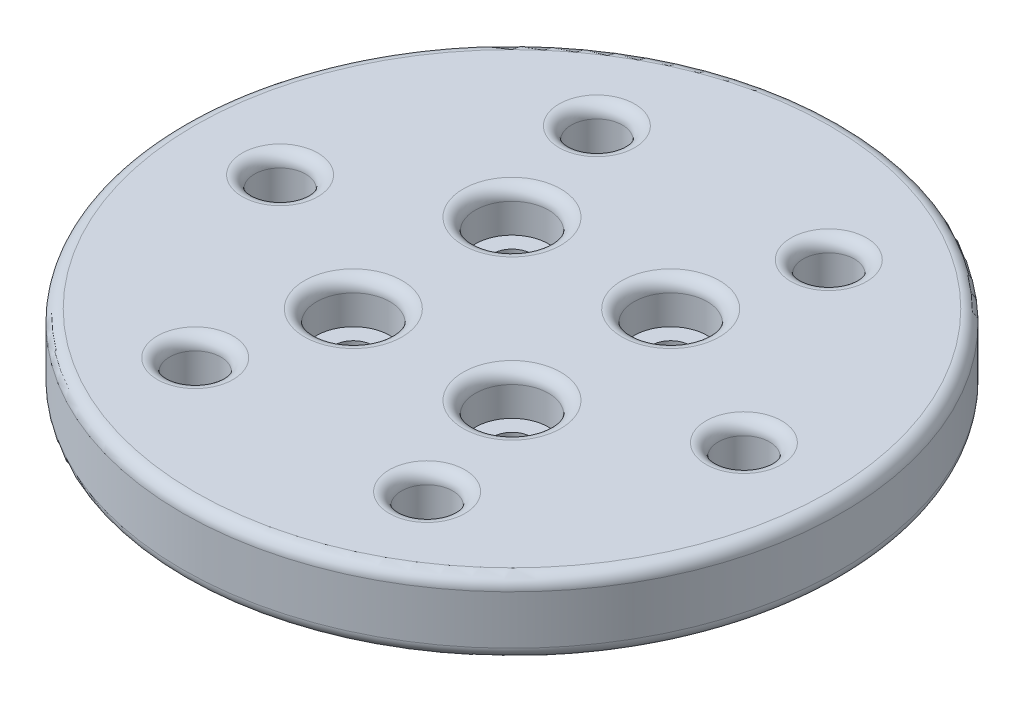
ISO-10303-21;
HEADER;
FILE_DESCRIPTION(('STEP AP214'),'2;1');
FILE_NAME('part.step','',(''),(''),'','','');
FILE_SCHEMA(('AUTOMOTIVE_DESIGN { 1 0 10303 214 1 1 1 1 }'));
ENDSEC;
DATA;
#1=APPLICATION_CONTEXT('core data for automotive mechanical design processes');
#2=APPLICATION_PROTOCOL_DEFINITION('international standard','automotive_design',2000,#1);
#3=PRODUCT_CONTEXT('',#1,'mechanical');
#4=PRODUCT('Part','Part','',(#3));
#5=PRODUCT_RELATED_PRODUCT_CATEGORY('part','',(#4));
#6=PRODUCT_DEFINITION_FORMATION('','',#4);
#7=PRODUCT_DEFINITION_CONTEXT('part definition',#1,'design');
#8=PRODUCT_DEFINITION('design','',#6,#7);
#9=PRODUCT_DEFINITION_SHAPE('','',#8);
#10=(LENGTH_UNIT() NAMED_UNIT(*) SI_UNIT(.MILLI.,.METRE.));
#11=(NAMED_UNIT(*) PLANE_ANGLE_UNIT() SI_UNIT($,.RADIAN.));
#12=(NAMED_UNIT(*) SI_UNIT($,.STERADIAN.) SOLID_ANGLE_UNIT());
#13=UNCERTAINTY_MEASURE_WITH_UNIT(LENGTH_MEASURE(1.E-05),#10,'distance_accuracy_value','');
#14=(GEOMETRIC_REPRESENTATION_CONTEXT(3) GLOBAL_UNCERTAINTY_ASSIGNED_CONTEXT((#13)) GLOBAL_UNIT_ASSIGNED_CONTEXT((#10,
#11,#12)) REPRESENTATION_CONTEXT('',''));
#15=CARTESIAN_POINT('',(0.,0.,0.));
#16=DIRECTION('',(0.,0.,1.));
#17=DIRECTION('',(1.,0.,0.));
#18=AXIS2_PLACEMENT_3D('',#15,#16,#17);
#19=CARTESIAN_POINT('',(6.5,0.,-6.5));
#20=DIRECTION('',(0.,1.,0.));
#21=DIRECTION('',(0.,0.,1.));
#22=AXIS2_PLACEMENT_3D('',#19,#20,#21);
#23=CYLINDRICAL_SURFACE('',#22,1.6);
#24=CARTESIAN_POINT('',(6.5,1.,-6.5));
#25=DIRECTION('',(0.,1.,0.));
#26=DIRECTION('',(0.,0.,1.));
#27=AXIS2_PLACEMENT_3D('',#24,#25,#26);
#28=CIRCLE('',#27,1.6);
#29=CARTESIAN_POINT('',(6.5,1.,-4.9));
#30=VERTEX_POINT('',#29);
#31=EDGE_CURVE('E117',#30,#30,#28,.F.);
#32=ORIENTED_EDGE('',*,*,#31,.T.);
#33=EDGE_LOOP('',(#32));
#34=FACE_BOUND('',#33,.T.);
#35=CARTESIAN_POINT('',(6.5,2.6,-6.5));
#36=DIRECTION('',(0.,1.,0.));
#37=DIRECTION('',(0.,0.,1.));
#38=AXIS2_PLACEMENT_3D('',#35,#36,#37);
#39=CIRCLE('',#38,1.6);
#40=CARTESIAN_POINT('',(6.5,2.6,-4.9));
#41=VERTEX_POINT('',#40);
#42=EDGE_CURVE('E221',#41,#41,#39,.F.);
#43=ORIENTED_EDGE('',*,*,#42,.F.);
#44=EDGE_LOOP('',(#43));
#45=FACE_BOUND('',#44,.T.);
#46=ADVANCED_FACE('F37',(#34,#45),#23,.F.);
#47=CARTESIAN_POINT('',(6.50000000000036,0.,6.5));
#48=DIRECTION('',(0.,1.,0.));
#49=DIRECTION('',(0.,0.,1.));
#50=AXIS2_PLACEMENT_3D('',#47,#48,#49);
#51=CYLINDRICAL_SURFACE('',#50,1.6);
#52=CARTESIAN_POINT('',(6.50000000000036,1.,6.5));
#53=DIRECTION('',(0.,1.,0.));
#54=DIRECTION('',(0.,0.,1.));
#55=AXIS2_PLACEMENT_3D('',#52,#53,#54);
#56=CIRCLE('',#55,1.6);
#57=CARTESIAN_POINT('',(6.50000000000036,1.,8.1));
#58=VERTEX_POINT('',#57);
#59=EDGE_CURVE('E113',#58,#58,#56,.F.);
#60=ORIENTED_EDGE('',*,*,#59,.T.);
#61=EDGE_LOOP('',(#60));
#62=FACE_BOUND('',#61,.T.);
#63=CARTESIAN_POINT('',(6.50000000000036,2.6,6.5));
#64=DIRECTION('',(0.,1.,0.));
#65=DIRECTION('',(0.,0.,1.));
#66=AXIS2_PLACEMENT_3D('',#63,#64,#65);
#67=CIRCLE('',#66,1.6);
#68=CARTESIAN_POINT('',(6.50000000000036,2.6,8.1));
#69=VERTEX_POINT('',#68);
#70=EDGE_CURVE('E225',#69,#69,#67,.F.);
#71=ORIENTED_EDGE('',*,*,#70,.F.);
#72=EDGE_LOOP('',(#71));
#73=FACE_BOUND('',#72,.T.);
#74=ADVANCED_FACE('F273',(#62,#73),#51,.F.);
#75=CARTESIAN_POINT('',(-6.49999999999964,0.,6.50000000000036));
#76=DIRECTION('',(0.,1.,0.));
#77=DIRECTION('',(0.,0.,1.));
#78=AXIS2_PLACEMENT_3D('',#75,#76,#77);
#79=CYLINDRICAL_SURFACE('',#78,1.6);
#80=CARTESIAN_POINT('',(-6.49999999999964,1.,6.50000000000036));
#81=DIRECTION('',(0.,1.,0.));
#82=DIRECTION('',(0.,0.,1.));
#83=AXIS2_PLACEMENT_3D('',#80,#81,#82);
#84=CIRCLE('',#83,1.6);
#85=CARTESIAN_POINT('',(-6.49999999999964,1.,8.10000000000036));
#86=VERTEX_POINT('',#85);
#87=EDGE_CURVE('E109',#86,#86,#84,.F.);
#88=ORIENTED_EDGE('',*,*,#87,.T.);
#89=EDGE_LOOP('',(#88));
#90=FACE_BOUND('',#89,.T.);
#91=CARTESIAN_POINT('',(-6.49999999999964,2.6,6.50000000000036));
#92=DIRECTION('',(0.,1.,0.));
#93=DIRECTION('',(0.,0.,1.));
#94=AXIS2_PLACEMENT_3D('',#91,#92,#93);
#95=CIRCLE('',#94,1.6);
#96=CARTESIAN_POINT('',(-6.49999999999964,2.6,8.10000000000036));
#97=VERTEX_POINT('',#96);
#98=EDGE_CURVE('E229',#97,#97,#95,.F.);
#99=ORIENTED_EDGE('',*,*,#98,.F.);
#100=EDGE_LOOP('',(#99));
#101=FACE_BOUND('',#100,.T.);
#102=ADVANCED_FACE('F279',(#90,#101),#79,.F.);
#103=CARTESIAN_POINT('',(-6.5,0.,-6.49999999999964));
#104=DIRECTION('',(0.,1.,0.));
#105=DIRECTION('',(0.,0.,1.));
#106=AXIS2_PLACEMENT_3D('',#103,#104,#105);
#107=CYLINDRICAL_SURFACE('',#106,1.6);
#108=CARTESIAN_POINT('',(-6.5,1.,-6.49999999999964));
#109=DIRECTION('',(0.,1.,0.));
#110=DIRECTION('',(0.,0.,1.));
#111=AXIS2_PLACEMENT_3D('',#108,#109,#110);
#112=CIRCLE('',#111,1.6);
#113=CARTESIAN_POINT('',(-6.5,1.,-4.89999999999964));
#114=VERTEX_POINT('',#113);
#115=EDGE_CURVE('E105',#114,#114,#112,.F.);
#116=ORIENTED_EDGE('',*,*,#115,.T.);
#117=EDGE_LOOP('',(#116));
#118=FACE_BOUND('',#117,.T.);
#119=CARTESIAN_POINT('',(-6.5,2.6,-6.49999999999964));
#120=DIRECTION('',(0.,1.,0.));
#121=DIRECTION('',(0.,0.,1.));
#122=AXIS2_PLACEMENT_3D('',#119,#120,#121);
#123=CIRCLE('',#122,1.6);
#124=CARTESIAN_POINT('',(-6.5,2.6,-4.89999999999964));
#125=VERTEX_POINT('',#124);
#126=EDGE_CURVE('E233',#125,#125,#123,.F.);
#127=ORIENTED_EDGE('',*,*,#126,.F.);
#128=EDGE_LOOP('',(#127));
#129=FACE_BOUND('',#128,.T.);
#130=ADVANCED_FACE('F285',(#118,#129),#107,.F.);
#131=CARTESIAN_POINT('',(0.,6.,0.));
#132=DIRECTION('',(0.,1.,0.));
#133=DIRECTION('',(0.,0.,1.));
#134=AXIS2_PLACEMENT_3D('',#131,#132,#133);
#135=PLANE('',#134);
#136=CARTESIAN_POINT('',(9.50000000000019,6.,-16.4544826719042));
#137=DIRECTION('',(0.,1.,0.));
#138=DIRECTION('',(0.,0.,1.));
#139=AXIS2_PLACEMENT_3D('',#136,#137,#138);
#140=CIRCLE('',#139,3.1);
#141=CARTESIAN_POINT('',(9.50000000000019,6.,-13.3544826719042));
#142=VERTEX_POINT('',#141);
#143=EDGE_CURVE('E61',#142,#142,#140,.F.);
#144=ORIENTED_EDGE('',*,*,#143,.T.);
#145=EDGE_LOOP('',(#144));
#146=FACE_BOUND('',#145,.T.);
#147=CARTESIAN_POINT('',(-19.,6.,-1.32676290876039E-13));
#148=DIRECTION('',(0.,1.,0.));
#149=DIRECTION('',(0.,0.,1.));
#150=AXIS2_PLACEMENT_3D('',#147,#148,#149);
#151=CIRCLE('',#150,3.1);
#152=CARTESIAN_POINT('',(-19.,6.,3.09999999999987));
#153=VERTEX_POINT('',#152);
#154=EDGE_CURVE('E65',#153,#153,#151,.F.);
#155=ORIENTED_EDGE('',*,*,#154,.T.);
#156=EDGE_LOOP('',(#155));
#157=FACE_BOUND('',#156,.T.);
#158=CARTESIAN_POINT('',(9.49999999999996,6.,16.4544826719044));
#159=DIRECTION('',(0.,1.,0.));
#160=DIRECTION('',(0.,0.,1.));
#161=AXIS2_PLACEMENT_3D('',#158,#159,#160);
#162=CIRCLE('',#161,3.1);
#163=CARTESIAN_POINT('',(9.49999999999996,6.,19.5544826719043));
#164=VERTEX_POINT('',#163);
#165=EDGE_CURVE('E69',#164,#164,#162,.F.);
#166=ORIENTED_EDGE('',*,*,#165,.T.);
#167=EDGE_LOOP('',(#166));
#168=FACE_BOUND('',#167,.T.);
#169=CARTESIAN_POINT('',(0.,6.,0.));
#170=DIRECTION('',(0.,1.,0.));
#171=DIRECTION('',(0.,0.,1.));
#172=AXIS2_PLACEMENT_3D('',#169,#170,#171);
#173=CIRCLE('',#172,26.);
#174=CARTESIAN_POINT('',(0.,6.,26.));
#175=VERTEX_POINT('',#174);
#176=EDGE_CURVE('E73',#175,#175,#173,.T.);
#177=ORIENTED_EDGE('',*,*,#176,.T.);
#178=EDGE_LOOP('',(#177));
#179=FACE_BOUND('',#178,.T.);
#180=CARTESIAN_POINT('',(19.,6.,0.));
#181=DIRECTION('',(0.,1.,0.));
#182=DIRECTION('',(0.,0.,1.));
#183=AXIS2_PLACEMENT_3D('',#180,#181,#182);
#184=CIRCLE('',#183,3.1);
#185=CARTESIAN_POINT('',(19.,6.,3.1));
#186=VERTEX_POINT('',#185);
#187=EDGE_CURVE('E77',#186,#186,#184,.F.);
#188=ORIENTED_EDGE('',*,*,#187,.T.);
#189=EDGE_LOOP('',(#188));
#190=FACE_BOUND('',#189,.T.);
#191=CARTESIAN_POINT('',(-9.50000000000008,6.,16.4544826719043));
#192=DIRECTION('',(0.,1.,0.));
#193=DIRECTION('',(0.,0.,1.));
#194=AXIS2_PLACEMENT_3D('',#191,#192,#193);
#195=CIRCLE('',#194,3.1);
#196=CARTESIAN_POINT('',(-9.50000000000008,6.,19.5544826719043));
#197=VERTEX_POINT('',#196);
#198=EDGE_CURVE('E81',#197,#197,#195,.F.);
#199=ORIENTED_EDGE('',*,*,#198,.T.);
#200=EDGE_LOOP('',(#199));
#201=FACE_BOUND('',#200,.T.);
#202=CARTESIAN_POINT('',(-9.49999999999985,6.,-16.4544826719044));
#203=DIRECTION('',(0.,1.,0.));
#204=DIRECTION('',(0.,0.,1.));
#205=AXIS2_PLACEMENT_3D('',#202,#203,#204);
#206=CIRCLE('',#205,3.1);
#207=CARTESIAN_POINT('',(-9.49999999999985,6.,-13.3544826719044));
#208=VERTEX_POINT('',#207);
#209=EDGE_CURVE('E85',#208,#208,#206,.F.);
#210=ORIENTED_EDGE('',*,*,#209,.T.);
#211=EDGE_LOOP('',(#210));
#212=FACE_BOUND('',#211,.T.);
#213=CARTESIAN_POINT('',(6.5,6.,-6.5));
#214=DIRECTION('',(0.,1.,0.));
#215=DIRECTION('',(0.,0.,1.));
#216=AXIS2_PLACEMENT_3D('',#213,#214,#215);
#217=CIRCLE('',#216,4.);
#218=CARTESIAN_POINT('',(6.5,6.,-2.5));
#219=VERTEX_POINT('',#218);
#220=EDGE_CURVE('E89',#219,#219,#217,.F.);
#221=ORIENTED_EDGE('',*,*,#220,.T.);
#222=EDGE_LOOP('',(#221));
#223=FACE_BOUND('',#222,.T.);
#224=CARTESIAN_POINT('',(6.50000000000036,6.,6.5));
#225=DIRECTION('',(0.,1.,0.));
#226=DIRECTION('',(0.,0.,1.));
#227=AXIS2_PLACEMENT_3D('',#224,#225,#226);
#228=CIRCLE('',#227,4.);
#229=CARTESIAN_POINT('',(6.50000000000036,6.,10.5));
#230=VERTEX_POINT('',#229);
#231=EDGE_CURVE('E93',#230,#230,#228,.F.);
#232=ORIENTED_EDGE('',*,*,#231,.T.);
#233=EDGE_LOOP('',(#232));
#234=FACE_BOUND('',#233,.T.);
#235=CARTESIAN_POINT('',(-6.49999999999964,6.,6.50000000000036));
#236=DIRECTION('',(0.,1.,0.));
#237=DIRECTION('',(0.,0.,1.));
#238=AXIS2_PLACEMENT_3D('',#235,#236,#237);
#239=CIRCLE('',#238,4.);
#240=CARTESIAN_POINT('',(-6.49999999999964,6.,10.5000000000004));
#241=VERTEX_POINT('',#240);
#242=EDGE_CURVE('E97',#241,#241,#239,.F.);
#243=ORIENTED_EDGE('',*,*,#242,.T.);
#244=EDGE_LOOP('',(#243));
#245=FACE_BOUND('',#244,.T.);
#246=CARTESIAN_POINT('',(-6.5,6.,-6.49999999999964));
#247=DIRECTION('',(0.,1.,0.));
#248=DIRECTION('',(0.,0.,1.));
#249=AXIS2_PLACEMENT_3D('',#246,#247,#248);
#250=CIRCLE('',#249,4.);
#251=CARTESIAN_POINT('',(-6.5,6.,-2.49999999999964));
#252=VERTEX_POINT('',#251);
#253=EDGE_CURVE('E101',#252,#252,#250,.F.);
#254=ORIENTED_EDGE('',*,*,#253,.T.);
#255=EDGE_LOOP('',(#254));
#256=FACE_BOUND('',#255,.T.);
#257=ADVANCED_FACE('F313',(#146,#157,#168,#179,#190,#201,#212,#223,#234,#245,#256),#135,.T.);
#258=CARTESIAN_POINT('',(0.,0.,0.));
#259=DIRECTION('',(0.,1.,0.));
#260=DIRECTION('',(0.,0.,1.));
#261=AXIS2_PLACEMENT_3D('',#258,#259,#260);
#262=PLANE('',#261);
#263=CARTESIAN_POINT('',(9.50000000000019,0.,-16.4544826719042));
#264=DIRECTION('',(0.,1.,0.));
#265=DIRECTION('',(0.,0.,1.));
#266=AXIS2_PLACEMENT_3D('',#263,#264,#265);
#267=CIRCLE('',#266,3.1);
#268=CARTESIAN_POINT('',(9.50000000000019,0.,-13.3544826719042));
#269=VERTEX_POINT('',#268);
#270=EDGE_CURVE('E177',#269,#269,#267,.T.);
#271=ORIENTED_EDGE('',*,*,#270,.T.);
#272=EDGE_LOOP('',(#271));
#273=FACE_BOUND('',#272,.T.);
#274=CARTESIAN_POINT('',(-9.49999999999985,0.,-16.4544826719044));
#275=DIRECTION('',(0.,1.,0.));
#276=DIRECTION('',(0.,0.,1.));
#277=AXIS2_PLACEMENT_3D('',#274,#275,#276);
#278=CIRCLE('',#277,3.1);
#279=CARTESIAN_POINT('',(-9.49999999999985,0.,-13.3544826719044));
#280=VERTEX_POINT('',#279);
#281=EDGE_CURVE('E181',#280,#280,#278,.T.);
#282=ORIENTED_EDGE('',*,*,#281,.T.);
#283=EDGE_LOOP('',(#282));
#284=FACE_BOUND('',#283,.T.);
#285=CARTESIAN_POINT('',(-19.,0.,-1.32676290876039E-13));
#286=DIRECTION('',(0.,1.,0.));
#287=DIRECTION('',(0.,0.,1.));
#288=AXIS2_PLACEMENT_3D('',#285,#286,#287);
#289=CIRCLE('',#288,3.1);
#290=CARTESIAN_POINT('',(-19.,0.,3.09999999999987));
#291=VERTEX_POINT('',#290);
#292=EDGE_CURVE('E185',#291,#291,#289,.T.);
#293=ORIENTED_EDGE('',*,*,#292,.T.);
#294=EDGE_LOOP('',(#293));
#295=FACE_BOUND('',#294,.T.);
#296=CARTESIAN_POINT('',(-9.50000000000008,0.,16.4544826719043));
#297=DIRECTION('',(0.,1.,0.));
#298=DIRECTION('',(0.,0.,1.));
#299=AXIS2_PLACEMENT_3D('',#296,#297,#298);
#300=CIRCLE('',#299,3.1);
#301=CARTESIAN_POINT('',(-9.50000000000008,0.,19.5544826719043));
#302=VERTEX_POINT('',#301);
#303=EDGE_CURVE('E189',#302,#302,#300,.T.);
#304=ORIENTED_EDGE('',*,*,#303,.T.);
#305=EDGE_LOOP('',(#304));
#306=FACE_BOUND('',#305,.T.);
#307=CARTESIAN_POINT('',(9.49999999999996,0.,16.4544826719044));
#308=DIRECTION('',(0.,1.,0.));
#309=DIRECTION('',(0.,0.,1.));
#310=AXIS2_PLACEMENT_3D('',#307,#308,#309);
#311=CIRCLE('',#310,3.1);
#312=CARTESIAN_POINT('',(9.49999999999996,0.,19.5544826719043));
#313=VERTEX_POINT('',#312);
#314=EDGE_CURVE('E193',#313,#313,#311,.T.);
#315=ORIENTED_EDGE('',*,*,#314,.T.);
#316=EDGE_LOOP('',(#315));
#317=FACE_BOUND('',#316,.T.);
#318=CARTESIAN_POINT('',(19.,0.,0.));
#319=DIRECTION('',(0.,1.,0.));
#320=DIRECTION('',(0.,0.,1.));
#321=AXIS2_PLACEMENT_3D('',#318,#319,#320);
#322=CIRCLE('',#321,3.1);
#323=CARTESIAN_POINT('',(19.,0.,3.1));
#324=VERTEX_POINT('',#323);
#325=EDGE_CURVE('E197',#324,#324,#322,.T.);
#326=ORIENTED_EDGE('',*,*,#325,.T.);
#327=EDGE_LOOP('',(#326));
#328=FACE_BOUND('',#327,.T.);
#329=CARTESIAN_POINT('',(0.,0.,0.));
#330=DIRECTION('',(0.,1.,0.));
#331=DIRECTION('',(0.,0.,1.));
#332=AXIS2_PLACEMENT_3D('',#329,#330,#331);
#333=CIRCLE('',#332,26.);
#334=CARTESIAN_POINT('',(0.,0.,26.));
#335=VERTEX_POINT('',#334);
#336=EDGE_CURVE('E201',#335,#335,#333,.F.);
#337=ORIENTED_EDGE('',*,*,#336,.T.);
#338=EDGE_LOOP('',(#337));
#339=FACE_BOUND('',#338,.T.);
#340=CARTESIAN_POINT('',(6.5,0.,-6.5));
#341=DIRECTION('',(0.,1.,0.));
#342=DIRECTION('',(0.,0.,1.));
#343=AXIS2_PLACEMENT_3D('',#340,#341,#342);
#344=CIRCLE('',#343,2.6);
#345=CARTESIAN_POINT('',(6.5,0.,-3.9));
#346=VERTEX_POINT('',#345);
#347=EDGE_CURVE('E205',#346,#346,#344,.T.);
#348=ORIENTED_EDGE('',*,*,#347,.T.);
#349=EDGE_LOOP('',(#348));
#350=FACE_BOUND('',#349,.T.);
#351=CARTESIAN_POINT('',(6.50000000000036,0.,6.5));
#352=DIRECTION('',(0.,1.,0.));
#353=DIRECTION('',(0.,0.,1.));
#354=AXIS2_PLACEMENT_3D('',#351,#352,#353);
#355=CIRCLE('',#354,2.6);
#356=CARTESIAN_POINT('',(6.50000000000036,0.,9.1));
#357=VERTEX_POINT('',#356);
#358=EDGE_CURVE('E209',#357,#357,#355,.T.);
#359=ORIENTED_EDGE('',*,*,#358,.T.);
#360=EDGE_LOOP('',(#359));
#361=FACE_BOUND('',#360,.T.);
#362=CARTESIAN_POINT('',(-6.49999999999964,0.,6.50000000000036));
#363=DIRECTION('',(0.,1.,0.));
#364=DIRECTION('',(0.,0.,1.));
#365=AXIS2_PLACEMENT_3D('',#362,#363,#364);
#366=CIRCLE('',#365,2.6);
#367=CARTESIAN_POINT('',(-6.49999999999964,0.,9.10000000000036));
#368=VERTEX_POINT('',#367);
#369=EDGE_CURVE('E213',#368,#368,#366,.T.);
#370=ORIENTED_EDGE('',*,*,#369,.T.);
#371=EDGE_LOOP('',(#370));
#372=FACE_BOUND('',#371,.T.);
#373=CARTESIAN_POINT('',(-6.5,0.,-6.49999999999964));
#374=DIRECTION('',(0.,1.,0.));
#375=DIRECTION('',(0.,0.,1.));
#376=AXIS2_PLACEMENT_3D('',#373,#374,#375);
#377=CIRCLE('',#376,2.6);
#378=CARTESIAN_POINT('',(-6.5,0.,-3.89999999999964));
#379=VERTEX_POINT('',#378);
#380=EDGE_CURVE('E217',#379,#379,#377,.T.);
#381=ORIENTED_EDGE('',*,*,#380,.T.);
#382=EDGE_LOOP('',(#381));
#383=FACE_BOUND('',#382,.T.);
#384=ADVANCED_FACE('F316',(#273,#284,#295,#306,#317,#328,#339,#350,#361,#372,#383),#262,.F.);
#385=CARTESIAN_POINT('',(0.,6.,0.));
#386=DIRECTION('',(0.,-1.,0.));
#387=DIRECTION('',(0.,0.,-1.));
#388=AXIS2_PLACEMENT_3D('',#385,#386,#387);
#389=CYLINDRICAL_SURFACE('',#388,27.);
#390=CARTESIAN_POINT('',(0.,1.,0.));
#391=DIRECTION('',(0.,1.,0.));
#392=DIRECTION('',(0.,0.,1.));
#393=AXIS2_PLACEMENT_3D('',#390,#391,#392);
#394=CIRCLE('',#393,27.);
#395=CARTESIAN_POINT('',(0.,1.,27.));
#396=VERTEX_POINT('',#395);
#397=EDGE_CURVE('E121',#396,#396,#394,.T.);
#398=ORIENTED_EDGE('',*,*,#397,.T.);
#399=EDGE_LOOP('',(#398));
#400=FACE_BOUND('',#399,.T.);
#401=CARTESIAN_POINT('',(0.,5.,0.));
#402=DIRECTION('',(0.,1.,0.));
#403=DIRECTION('',(0.,0.,1.));
#404=AXIS2_PLACEMENT_3D('',#401,#402,#403);
#405=CIRCLE('',#404,27.);
#406=CARTESIAN_POINT('',(0.,5.,27.));
#407=VERTEX_POINT('',#406);
#408=EDGE_CURVE('E125',#407,#407,#405,.F.);
#409=ORIENTED_EDGE('',*,*,#408,.T.);
#410=EDGE_LOOP('',(#409));
#411=FACE_BOUND('',#410,.T.);
#412=ADVANCED_FACE('F311',(#400,#411),#389,.T.);
#413=CARTESIAN_POINT('',(19.,6.,0.));
#414=DIRECTION('',(0.,-1.,0.));
#415=DIRECTION('',(0.,0.,-1.));
#416=AXIS2_PLACEMENT_3D('',#413,#414,#415);
#417=CYLINDRICAL_SURFACE('',#416,2.1);
#418=CARTESIAN_POINT('',(19.,1.,0.));
#419=DIRECTION('',(0.,1.,0.));
#420=DIRECTION('',(0.,0.,1.));
#421=AXIS2_PLACEMENT_3D('',#418,#419,#420);
#422=CIRCLE('',#421,2.1);
#423=CARTESIAN_POINT('',(19.,1.,2.1));
#424=VERTEX_POINT('',#423);
#425=EDGE_CURVE('E129',#424,#424,#422,.F.);
#426=ORIENTED_EDGE('',*,*,#425,.T.);
#427=EDGE_LOOP('',(#426));
#428=FACE_BOUND('',#427,.T.);
#429=CARTESIAN_POINT('',(19.,5.,0.));
#430=DIRECTION('',(0.,1.,0.));
#431=DIRECTION('',(0.,0.,1.));
#432=AXIS2_PLACEMENT_3D('',#429,#430,#431);
#433=CIRCLE('',#432,2.1);
#434=CARTESIAN_POINT('',(19.,5.,2.1));
#435=VERTEX_POINT('',#434);
#436=EDGE_CURVE('E133',#435,#435,#433,.T.);
#437=ORIENTED_EDGE('',*,*,#436,.T.);
#438=EDGE_LOOP('',(#437));
#439=FACE_BOUND('',#438,.T.);
#440=ADVANCED_FACE('F307',(#428,#439),#417,.F.);
#441=CARTESIAN_POINT('',(9.49999999999996,6.,16.4544826719044));
#442=DIRECTION('',(0.,-1.,0.));
#443=DIRECTION('',(0.,0.,-1.));
#444=AXIS2_PLACEMENT_3D('',#441,#442,#443);
#445=CYLINDRICAL_SURFACE('',#444,2.1);
#446=CARTESIAN_POINT('',(9.49999999999996,1.,16.4544826719044));
#447=DIRECTION('',(0.,1.,0.));
#448=DIRECTION('',(0.,0.,1.));
#449=AXIS2_PLACEMENT_3D('',#446,#447,#448);
#450=CIRCLE('',#449,2.1);
#451=CARTESIAN_POINT('',(9.49999999999996,1.,18.5544826719043));
#452=VERTEX_POINT('',#451);
#453=EDGE_CURVE('E137',#452,#452,#450,.F.);
#454=ORIENTED_EDGE('',*,*,#453,.T.);
#455=EDGE_LOOP('',(#454));
#456=FACE_BOUND('',#455,.T.);
#457=CARTESIAN_POINT('',(9.49999999999996,5.,16.4544826719044));
#458=DIRECTION('',(0.,1.,0.));
#459=DIRECTION('',(0.,0.,1.));
#460=AXIS2_PLACEMENT_3D('',#457,#458,#459);
#461=CIRCLE('',#460,2.1);
#462=CARTESIAN_POINT('',(9.49999999999996,5.,18.5544826719043));
#463=VERTEX_POINT('',#462);
#464=EDGE_CURVE('E141',#463,#463,#461,.T.);
#465=ORIENTED_EDGE('',*,*,#464,.T.);
#466=EDGE_LOOP('',(#465));
#467=FACE_BOUND('',#466,.T.);
#468=ADVANCED_FACE('F303',(#456,#467),#445,.F.);
#469=CARTESIAN_POINT('',(-9.50000000000008,6.,16.4544826719043));
#470=DIRECTION('',(0.,-1.,0.));
#471=DIRECTION('',(0.,0.,-1.));
#472=AXIS2_PLACEMENT_3D('',#469,#470,#471);
#473=CYLINDRICAL_SURFACE('',#472,2.1);
#474=CARTESIAN_POINT('',(-9.50000000000008,1.,16.4544826719043));
#475=DIRECTION('',(0.,1.,0.));
#476=DIRECTION('',(0.,0.,1.));
#477=AXIS2_PLACEMENT_3D('',#474,#475,#476);
#478=CIRCLE('',#477,2.1);
#479=CARTESIAN_POINT('',(-9.50000000000008,1.,18.5544826719043));
#480=VERTEX_POINT('',#479);
#481=EDGE_CURVE('E145',#480,#480,#478,.F.);
#482=ORIENTED_EDGE('',*,*,#481,.T.);
#483=EDGE_LOOP('',(#482));
#484=FACE_BOUND('',#483,.T.);
#485=CARTESIAN_POINT('',(-9.50000000000008,5.,16.4544826719043));
#486=DIRECTION('',(0.,1.,0.));
#487=DIRECTION('',(0.,0.,1.));
#488=AXIS2_PLACEMENT_3D('',#485,#486,#487);
#489=CIRCLE('',#488,2.1);
#490=CARTESIAN_POINT('',(-9.50000000000008,5.,18.5544826719043));
#491=VERTEX_POINT('',#490);
#492=EDGE_CURVE('E149',#491,#491,#489,.T.);
#493=ORIENTED_EDGE('',*,*,#492,.T.);
#494=EDGE_LOOP('',(#493));
#495=FACE_BOUND('',#494,.T.);
#496=ADVANCED_FACE('F299',(#484,#495),#473,.F.);
#497=CARTESIAN_POINT('',(-19.,6.,-1.32676290876039E-13));
#498=DIRECTION('',(0.,-1.,0.));
#499=DIRECTION('',(0.,0.,-1.));
#500=AXIS2_PLACEMENT_3D('',#497,#498,#499);
#501=CYLINDRICAL_SURFACE('',#500,2.1);
#502=CARTESIAN_POINT('',(-19.,1.,-1.32676290876039E-13));
#503=DIRECTION('',(0.,1.,0.));
#504=DIRECTION('',(0.,0.,1.));
#505=AXIS2_PLACEMENT_3D('',#502,#503,#504);
#506=CIRCLE('',#505,2.1);
#507=CARTESIAN_POINT('',(-19.,1.,2.09999999999987));
#508=VERTEX_POINT('',#507);
#509=EDGE_CURVE('E153',#508,#508,#506,.F.);
#510=ORIENTED_EDGE('',*,*,#509,.T.);
#511=EDGE_LOOP('',(#510));
#512=FACE_BOUND('',#511,.T.);
#513=CARTESIAN_POINT('',(-19.,5.,-1.32676290876039E-13));
#514=DIRECTION('',(0.,1.,0.));
#515=DIRECTION('',(0.,0.,1.));
#516=AXIS2_PLACEMENT_3D('',#513,#514,#515);
#517=CIRCLE('',#516,2.1);
#518=CARTESIAN_POINT('',(-19.,5.,2.09999999999987));
#519=VERTEX_POINT('',#518);
#520=EDGE_CURVE('E157',#519,#519,#517,.T.);
#521=ORIENTED_EDGE('',*,*,#520,.T.);
#522=EDGE_LOOP('',(#521));
#523=FACE_BOUND('',#522,.T.);
#524=ADVANCED_FACE('F295',(#512,#523),#501,.F.);
#525=CARTESIAN_POINT('',(-9.49999999999985,6.,-16.4544826719044));
#526=DIRECTION('',(0.,-1.,0.));
#527=DIRECTION('',(0.,0.,-1.));
#528=AXIS2_PLACEMENT_3D('',#525,#526,#527);
#529=CYLINDRICAL_SURFACE('',#528,2.1);
#530=CARTESIAN_POINT('',(-9.49999999999985,1.,-16.4544826719044));
#531=DIRECTION('',(0.,1.,0.));
#532=DIRECTION('',(0.,0.,1.));
#533=AXIS2_PLACEMENT_3D('',#530,#531,#532);
#534=CIRCLE('',#533,2.1);
#535=CARTESIAN_POINT('',(-9.49999999999985,1.,-14.3544826719044));
#536=VERTEX_POINT('',#535);
#537=EDGE_CURVE('E161',#536,#536,#534,.F.);
#538=ORIENTED_EDGE('',*,*,#537,.T.);
#539=EDGE_LOOP('',(#538));
#540=FACE_BOUND('',#539,.T.);
#541=CARTESIAN_POINT('',(-9.49999999999985,5.,-16.4544826719044));
#542=DIRECTION('',(0.,1.,0.));
#543=DIRECTION('',(0.,0.,1.));
#544=AXIS2_PLACEMENT_3D('',#541,#542,#543);
#545=CIRCLE('',#544,2.1);
#546=CARTESIAN_POINT('',(-9.49999999999985,5.,-14.3544826719044));
#547=VERTEX_POINT('',#546);
#548=EDGE_CURVE('E165',#547,#547,#545,.T.);
#549=ORIENTED_EDGE('',*,*,#548,.T.);
#550=EDGE_LOOP('',(#549));
#551=FACE_BOUND('',#550,.T.);
#552=ADVANCED_FACE('F291',(#540,#551),#529,.F.);
#553=CARTESIAN_POINT('',(9.50000000000019,6.,-16.4544826719042));
#554=DIRECTION('',(0.,-1.,0.));
#555=DIRECTION('',(0.,0.,-1.));
#556=AXIS2_PLACEMENT_3D('',#553,#554,#555);
#557=CYLINDRICAL_SURFACE('',#556,2.1);
#558=CARTESIAN_POINT('',(9.50000000000019,1.,-16.4544826719042));
#559=DIRECTION('',(0.,1.,0.));
#560=DIRECTION('',(0.,0.,1.));
#561=AXIS2_PLACEMENT_3D('',#558,#559,#560);
#562=CIRCLE('',#561,2.1);
#563=CARTESIAN_POINT('',(9.50000000000019,1.,-14.3544826719042));
#564=VERTEX_POINT('',#563);
#565=EDGE_CURVE('E169',#564,#564,#562,.F.);
#566=ORIENTED_EDGE('',*,*,#565,.T.);
#567=EDGE_LOOP('',(#566));
#568=FACE_BOUND('',#567,.T.);
#569=CARTESIAN_POINT('',(9.50000000000019,5.,-16.4544826719042));
#570=DIRECTION('',(0.,1.,0.));
#571=DIRECTION('',(0.,0.,1.));
#572=AXIS2_PLACEMENT_3D('',#569,#570,#571);
#573=CIRCLE('',#572,2.1);
#574=CARTESIAN_POINT('',(9.50000000000019,5.,-14.3544826719042));
#575=VERTEX_POINT('',#574);
#576=EDGE_CURVE('E173',#575,#575,#573,.T.);
#577=ORIENTED_EDGE('',*,*,#576,.T.);
#578=EDGE_LOOP('',(#577));
#579=FACE_BOUND('',#578,.T.);
#580=ADVANCED_FACE('F287',(#568,#579),#557,.F.);
#581=CARTESIAN_POINT('',(-6.5,2.6,-6.49999999999964));
#582=DIRECTION('',(0.,1.,0.));
#583=DIRECTION('',(0.,0.,1.));
#584=AXIS2_PLACEMENT_3D('',#581,#582,#583);
#585=PLANE('',#584);
#586=CARTESIAN_POINT('',(-6.5,2.6,-6.49999999999964));
#587=DIRECTION('',(0.,1.,0.));
#588=DIRECTION('',(0.,0.,1.));
#589=AXIS2_PLACEMENT_3D('',#586,#587,#588);
#590=CIRCLE('',#589,3.);
#591=CARTESIAN_POINT('',(-6.5,2.6,-3.49999999999964));
#592=VERTEX_POINT('',#591);
#593=EDGE_CURVE('E242',#592,#592,#590,.T.);
#594=ORIENTED_EDGE('',*,*,#593,.T.);
#595=EDGE_LOOP('',(#594));
#596=FACE_BOUND('',#595,.T.);
#597=ORIENTED_EDGE('',*,*,#126,.T.);
#598=EDGE_LOOP('',(#597));
#599=FACE_BOUND('',#598,.T.);
#600=ADVANCED_FACE('F290',(#596,#599),#585,.T.);
#601=CARTESIAN_POINT('',(-6.5,2.6,-6.49999999999964));
#602=DIRECTION('',(0.,1.,0.));
#603=DIRECTION('',(0.,0.,1.));
#604=AXIS2_PLACEMENT_3D('',#601,#602,#603);
#605=CYLINDRICAL_SURFACE('',#604,3.);
#606=CARTESIAN_POINT('',(-6.5,5.,-6.49999999999964));
#607=DIRECTION('',(0.,1.,0.));
#608=DIRECTION('',(0.,0.,1.));
#609=AXIS2_PLACEMENT_3D('',#606,#607,#608);
#610=CIRCLE('',#609,3.);
#611=CARTESIAN_POINT('',(-6.5,5.,-3.49999999999964));
#612=VERTEX_POINT('',#611);
#613=EDGE_CURVE('E10',#612,#612,#610,.T.);
#614=ORIENTED_EDGE('',*,*,#613,.T.);
#615=EDGE_LOOP('',(#614));
#616=FACE_BOUND('',#615,.T.);
#617=ORIENTED_EDGE('',*,*,#593,.F.);
#618=EDGE_LOOP('',(#617));
#619=FACE_BOUND('',#618,.T.);
#620=ADVANCED_FACE('F573',(#616,#619),#605,.F.);
#621=CARTESIAN_POINT('',(-6.49999999999964,2.6,6.50000000000036));
#622=DIRECTION('',(0.,1.,0.));
#623=DIRECTION('',(0.,0.,1.));
#624=AXIS2_PLACEMENT_3D('',#621,#622,#623);
#625=PLANE('',#624);
#626=CARTESIAN_POINT('',(-6.49999999999964,2.6,6.50000000000036));
#627=DIRECTION('',(0.,1.,0.));
#628=DIRECTION('',(0.,0.,1.));
#629=AXIS2_PLACEMENT_3D('',#626,#627,#628);
#630=CIRCLE('',#629,3.);
#631=CARTESIAN_POINT('',(-6.49999999999964,2.6,9.50000000000036));
#632=VERTEX_POINT('',#631);
#633=EDGE_CURVE('E246',#632,#632,#630,.T.);
#634=ORIENTED_EDGE('',*,*,#633,.T.);
#635=EDGE_LOOP('',(#634));
#636=FACE_BOUND('',#635,.T.);
#637=ORIENTED_EDGE('',*,*,#98,.T.);
#638=EDGE_LOOP('',(#637));
#639=FACE_BOUND('',#638,.T.);
#640=ADVANCED_FACE('F566',(#636,#639),#625,.T.);
#641=CARTESIAN_POINT('',(-6.49999999999964,2.6,6.50000000000036));
#642=DIRECTION('',(0.,1.,0.));
#643=DIRECTION('',(0.,0.,1.));
#644=AXIS2_PLACEMENT_3D('',#641,#642,#643);
#645=CYLINDRICAL_SURFACE('',#644,3.);
#646=CARTESIAN_POINT('',(-6.49999999999964,5.,6.50000000000036));
#647=DIRECTION('',(0.,1.,0.));
#648=DIRECTION('',(0.,0.,1.));
#649=AXIS2_PLACEMENT_3D('',#646,#647,#648);
#650=CIRCLE('',#649,3.);
#651=CARTESIAN_POINT('',(-6.49999999999964,5.,9.50000000000036));
#652=VERTEX_POINT('',#651);
#653=EDGE_CURVE('E45',#652,#652,#650,.T.);
#654=ORIENTED_EDGE('',*,*,#653,.T.);
#655=EDGE_LOOP('',(#654));
#656=FACE_BOUND('',#655,.T.);
#657=ORIENTED_EDGE('',*,*,#633,.F.);
#658=EDGE_LOOP('',(#657));
#659=FACE_BOUND('',#658,.T.);
#660=ADVANCED_FACE('F269',(#656,#659),#645,.F.);
#661=CARTESIAN_POINT('',(6.50000000000036,2.6,6.5));
#662=DIRECTION('',(0.,1.,0.));
#663=DIRECTION('',(0.,0.,1.));
#664=AXIS2_PLACEMENT_3D('',#661,#662,#663);
#665=PLANE('',#664);
#666=CARTESIAN_POINT('',(6.50000000000036,2.6,6.5));
#667=DIRECTION('',(0.,1.,0.));
#668=DIRECTION('',(0.,0.,1.));
#669=AXIS2_PLACEMENT_3D('',#666,#667,#668);
#670=CIRCLE('',#669,3.);
#671=CARTESIAN_POINT('',(6.50000000000036,2.6,9.5));
#672=VERTEX_POINT('',#671);
#673=EDGE_CURVE('E241',#672,#672,#670,.T.);
#674=ORIENTED_EDGE('',*,*,#673,.T.);
#675=EDGE_LOOP('',(#674));
#676=FACE_BOUND('',#675,.T.);
#677=ORIENTED_EDGE('',*,*,#70,.T.);
#678=EDGE_LOOP('',(#677));
#679=FACE_BOUND('',#678,.T.);
#680=ADVANCED_FACE('F254',(#676,#679),#665,.T.);
#681=CARTESIAN_POINT('',(6.50000000000036,2.6,6.5));
#682=DIRECTION('',(0.,1.,0.));
#683=DIRECTION('',(0.,0.,1.));
#684=AXIS2_PLACEMENT_3D('',#681,#682,#683);
#685=CYLINDRICAL_SURFACE('',#684,3.);
#686=CARTESIAN_POINT('',(6.50000000000036,5.,6.5));
#687=DIRECTION('',(0.,1.,0.));
#688=DIRECTION('',(0.,0.,1.));
#689=AXIS2_PLACEMENT_3D('',#686,#687,#688);
#690=CIRCLE('',#689,3.);
#691=CARTESIAN_POINT('',(6.50000000000036,5.,9.5));
#692=VERTEX_POINT('',#691);
#693=EDGE_CURVE('E50',#692,#692,#690,.T.);
#694=ORIENTED_EDGE('',*,*,#693,.T.);
#695=EDGE_LOOP('',(#694));
#696=FACE_BOUND('',#695,.T.);
#697=ORIENTED_EDGE('',*,*,#673,.F.);
#698=EDGE_LOOP('',(#697));
#699=FACE_BOUND('',#698,.T.);
#700=ADVANCED_FACE('F257',(#696,#699),#685,.F.);
#701=CARTESIAN_POINT('',(6.5,2.6,-6.5));
#702=DIRECTION('',(0.,1.,0.));
#703=DIRECTION('',(0.,0.,1.));
#704=AXIS2_PLACEMENT_3D('',#701,#702,#703);
#705=PLANE('',#704);
#706=CARTESIAN_POINT('',(6.5,2.6,-6.5));
#707=DIRECTION('',(0.,1.,0.));
#708=DIRECTION('',(0.,0.,1.));
#709=AXIS2_PLACEMENT_3D('',#706,#707,#708);
#710=CIRCLE('',#709,3.);
#711=CARTESIAN_POINT('',(6.5,2.6,-3.5));
#712=VERTEX_POINT('',#711);
#713=EDGE_CURVE('E237',#712,#712,#710,.T.);
#714=ORIENTED_EDGE('',*,*,#713,.T.);
#715=EDGE_LOOP('',(#714));
#716=FACE_BOUND('',#715,.T.);
#717=ORIENTED_EDGE('',*,*,#42,.T.);
#718=EDGE_LOOP('',(#717));
#719=FACE_BOUND('',#718,.T.);
#720=ADVANCED_FACE('F259',(#716,#719),#705,.T.);
#721=CARTESIAN_POINT('',(6.5,2.6,-6.5));
#722=DIRECTION('',(0.,1.,0.));
#723=DIRECTION('',(0.,0.,1.));
#724=AXIS2_PLACEMENT_3D('',#721,#722,#723);
#725=CYLINDRICAL_SURFACE('',#724,3.);
#726=CARTESIAN_POINT('',(6.5,5.,-6.5));
#727=DIRECTION('',(0.,1.,0.));
#728=DIRECTION('',(0.,0.,1.));
#729=AXIS2_PLACEMENT_3D('',#726,#727,#728);
#730=CIRCLE('',#729,3.);
#731=CARTESIAN_POINT('',(6.5,5.,-3.5));
#732=VERTEX_POINT('',#731);
#733=EDGE_CURVE('E55',#732,#732,#730,.T.);
#734=ORIENTED_EDGE('',*,*,#733,.T.);
#735=EDGE_LOOP('',(#734));
#736=FACE_BOUND('',#735,.T.);
#737=ORIENTED_EDGE('',*,*,#713,.F.);
#738=EDGE_LOOP('',(#737));
#739=FACE_BOUND('',#738,.T.);
#740=ADVANCED_FACE('F266',(#736,#739),#725,.F.);
#741=CARTESIAN_POINT('',(9.50000000000019,1.,-16.4544826719042));
#742=DIRECTION('',(0.,1.,0.));
#743=DIRECTION('',(0.,0.,1.));
#744=AXIS2_PLACEMENT_3D('',#741,#742,#743);
#745=TOROIDAL_SURFACE('',#744,3.1,1.);
#746=ORIENTED_EDGE('',*,*,#565,.F.);
#747=EDGE_LOOP('',(#746));
#748=FACE_BOUND('',#747,.T.);
#749=ORIENTED_EDGE('',*,*,#270,.F.);
#750=EDGE_LOOP('',(#749));
#751=FACE_BOUND('',#750,.T.);
#752=ADVANCED_FACE('F324',(#748,#751),#745,.T.);
#753=CARTESIAN_POINT('',(-9.49999999999985,1.,-16.4544826719044));
#754=DIRECTION('',(0.,1.,0.));
#755=DIRECTION('',(0.,0.,1.));
#756=AXIS2_PLACEMENT_3D('',#753,#754,#755);
#757=TOROIDAL_SURFACE('',#756,3.1,1.);
#758=ORIENTED_EDGE('',*,*,#537,.F.);
#759=EDGE_LOOP('',(#758));
#760=FACE_BOUND('',#759,.T.);
#761=ORIENTED_EDGE('',*,*,#281,.F.);
#762=EDGE_LOOP('',(#761));
#763=FACE_BOUND('',#762,.T.);
#764=ADVANCED_FACE('F327',(#760,#763),#757,.T.);
#765=CARTESIAN_POINT('',(-19.,1.,-1.32676290876039E-13));
#766=DIRECTION('',(0.,1.,0.));
#767=DIRECTION('',(0.,0.,1.));
#768=AXIS2_PLACEMENT_3D('',#765,#766,#767);
#769=TOROIDAL_SURFACE('',#768,3.1,1.);
#770=ORIENTED_EDGE('',*,*,#509,.F.);
#771=EDGE_LOOP('',(#770));
#772=FACE_BOUND('',#771,.T.);
#773=ORIENTED_EDGE('',*,*,#292,.F.);
#774=EDGE_LOOP('',(#773));
#775=FACE_BOUND('',#774,.T.);
#776=ADVANCED_FACE('F331',(#772,#775),#769,.T.);
#777=CARTESIAN_POINT('',(-9.50000000000008,1.,16.4544826719043));
#778=DIRECTION('',(0.,1.,0.));
#779=DIRECTION('',(0.,0.,1.));
#780=AXIS2_PLACEMENT_3D('',#777,#778,#779);
#781=TOROIDAL_SURFACE('',#780,3.1,1.);
#782=ORIENTED_EDGE('',*,*,#481,.F.);
#783=EDGE_LOOP('',(#782));
#784=FACE_BOUND('',#783,.T.);
#785=ORIENTED_EDGE('',*,*,#303,.F.);
#786=EDGE_LOOP('',(#785));
#787=FACE_BOUND('',#786,.T.);
#788=ADVANCED_FACE('F335',(#784,#787),#781,.T.);
#789=CARTESIAN_POINT('',(9.49999999999996,1.,16.4544826719044));
#790=DIRECTION('',(0.,1.,0.));
#791=DIRECTION('',(0.,0.,1.));
#792=AXIS2_PLACEMENT_3D('',#789,#790,#791);
#793=TOROIDAL_SURFACE('',#792,3.1,1.);
#794=ORIENTED_EDGE('',*,*,#453,.F.);
#795=EDGE_LOOP('',(#794));
#796=FACE_BOUND('',#795,.T.);
#797=ORIENTED_EDGE('',*,*,#314,.F.);
#798=EDGE_LOOP('',(#797));
#799=FACE_BOUND('',#798,.T.);
#800=ADVANCED_FACE('F339',(#796,#799),#793,.T.);
#801=CARTESIAN_POINT('',(19.,1.,0.));
#802=DIRECTION('',(0.,1.,0.));
#803=DIRECTION('',(0.,0.,1.));
#804=AXIS2_PLACEMENT_3D('',#801,#802,#803);
#805=TOROIDAL_SURFACE('',#804,3.1,1.);
#806=ORIENTED_EDGE('',*,*,#425,.F.);
#807=EDGE_LOOP('',(#806));
#808=FACE_BOUND('',#807,.T.);
#809=ORIENTED_EDGE('',*,*,#325,.F.);
#810=EDGE_LOOP('',(#809));
#811=FACE_BOUND('',#810,.T.);
#812=ADVANCED_FACE('F343',(#808,#811),#805,.T.);
#813=CARTESIAN_POINT('',(0.,1.,0.));
#814=DIRECTION('',(0.,1.,0.));
#815=DIRECTION('',(0.,0.,1.));
#816=AXIS2_PLACEMENT_3D('',#813,#814,#815);
#817=TOROIDAL_SURFACE('',#816,26.,1.);
#818=ORIENTED_EDGE('',*,*,#336,.F.);
#819=EDGE_LOOP('',(#818));
#820=FACE_BOUND('',#819,.T.);
#821=ORIENTED_EDGE('',*,*,#397,.F.);
#822=EDGE_LOOP('',(#821));
#823=FACE_BOUND('',#822,.T.);
#824=ADVANCED_FACE('F347',(#820,#823),#817,.T.);
#825=CARTESIAN_POINT('',(6.5,1.,-6.5));
#826=DIRECTION('',(0.,1.,0.));
#827=DIRECTION('',(0.,0.,1.));
#828=AXIS2_PLACEMENT_3D('',#825,#826,#827);
#829=TOROIDAL_SURFACE('',#828,2.6,1.);
#830=ORIENTED_EDGE('',*,*,#31,.F.);
#831=EDGE_LOOP('',(#830));
#832=FACE_BOUND('',#831,.T.);
#833=ORIENTED_EDGE('',*,*,#347,.F.);
#834=EDGE_LOOP('',(#833));
#835=FACE_BOUND('',#834,.T.);
#836=ADVANCED_FACE('F351',(#832,#835),#829,.T.);
#837=CARTESIAN_POINT('',(6.50000000000036,1.,6.5));
#838=DIRECTION('',(0.,1.,0.));
#839=DIRECTION('',(0.,0.,1.));
#840=AXIS2_PLACEMENT_3D('',#837,#838,#839);
#841=TOROIDAL_SURFACE('',#840,2.6,1.);
#842=ORIENTED_EDGE('',*,*,#59,.F.);
#843=EDGE_LOOP('',(#842));
#844=FACE_BOUND('',#843,.T.);
#845=ORIENTED_EDGE('',*,*,#358,.F.);
#846=EDGE_LOOP('',(#845));
#847=FACE_BOUND('',#846,.T.);
#848=ADVANCED_FACE('F355',(#844,#847),#841,.T.);
#849=CARTESIAN_POINT('',(-6.49999999999964,1.,6.50000000000036));
#850=DIRECTION('',(0.,1.,0.));
#851=DIRECTION('',(0.,0.,1.));
#852=AXIS2_PLACEMENT_3D('',#849,#850,#851);
#853=TOROIDAL_SURFACE('',#852,2.6,1.);
#854=ORIENTED_EDGE('',*,*,#87,.F.);
#855=EDGE_LOOP('',(#854));
#856=FACE_BOUND('',#855,.T.);
#857=ORIENTED_EDGE('',*,*,#369,.F.);
#858=EDGE_LOOP('',(#857));
#859=FACE_BOUND('',#858,.T.);
#860=ADVANCED_FACE('F359',(#856,#859),#853,.T.);
#861=CARTESIAN_POINT('',(-6.5,1.,-6.49999999999964));
#862=DIRECTION('',(0.,1.,0.));
#863=DIRECTION('',(0.,0.,1.));
#864=AXIS2_PLACEMENT_3D('',#861,#862,#863);
#865=TOROIDAL_SURFACE('',#864,2.6,1.);
#866=ORIENTED_EDGE('',*,*,#115,.F.);
#867=EDGE_LOOP('',(#866));
#868=FACE_BOUND('',#867,.T.);
#869=ORIENTED_EDGE('',*,*,#380,.F.);
#870=EDGE_LOOP('',(#869));
#871=FACE_BOUND('',#870,.T.);
#872=ADVANCED_FACE('F363',(#868,#871),#865,.T.);
#873=CARTESIAN_POINT('',(9.50000000000019,5.,-16.4544826719042));
#874=DIRECTION('',(0.,1.,0.));
#875=DIRECTION('',(0.,0.,1.));
#876=AXIS2_PLACEMENT_3D('',#873,#874,#875);
#877=TOROIDAL_SURFACE('',#876,3.1,1.);
#878=ORIENTED_EDGE('',*,*,#143,.F.);
#879=EDGE_LOOP('',(#878));
#880=FACE_BOUND('',#879,.T.);
#881=ORIENTED_EDGE('',*,*,#576,.F.);
#882=EDGE_LOOP('',(#881));
#883=FACE_BOUND('',#882,.T.);
#884=ADVANCED_FACE('F367',(#880,#883),#877,.T.);
#885=CARTESIAN_POINT('',(-19.,5.,-1.32676290876039E-13));
#886=DIRECTION('',(0.,1.,0.));
#887=DIRECTION('',(0.,0.,1.));
#888=AXIS2_PLACEMENT_3D('',#885,#886,#887);
#889=TOROIDAL_SURFACE('',#888,3.1,1.);
#890=ORIENTED_EDGE('',*,*,#154,.F.);
#891=EDGE_LOOP('',(#890));
#892=FACE_BOUND('',#891,.T.);
#893=ORIENTED_EDGE('',*,*,#520,.F.);
#894=EDGE_LOOP('',(#893));
#895=FACE_BOUND('',#894,.T.);
#896=ADVANCED_FACE('F371',(#892,#895),#889,.T.);
#897=CARTESIAN_POINT('',(9.49999999999996,5.,16.4544826719044));
#898=DIRECTION('',(0.,1.,0.));
#899=DIRECTION('',(0.,0.,1.));
#900=AXIS2_PLACEMENT_3D('',#897,#898,#899);
#901=TOROIDAL_SURFACE('',#900,3.1,1.);
#902=ORIENTED_EDGE('',*,*,#165,.F.);
#903=EDGE_LOOP('',(#902));
#904=FACE_BOUND('',#903,.T.);
#905=ORIENTED_EDGE('',*,*,#464,.F.);
#906=EDGE_LOOP('',(#905));
#907=FACE_BOUND('',#906,.T.);
#908=ADVANCED_FACE('F375',(#904,#907),#901,.T.);
#909=CARTESIAN_POINT('',(0.,5.,0.));
#910=DIRECTION('',(0.,1.,0.));
#911=DIRECTION('',(0.,0.,1.));
#912=AXIS2_PLACEMENT_3D('',#909,#910,#911);
#913=TOROIDAL_SURFACE('',#912,26.,1.);
#914=ORIENTED_EDGE('',*,*,#408,.F.);
#915=EDGE_LOOP('',(#914));
#916=FACE_BOUND('',#915,.T.);
#917=ORIENTED_EDGE('',*,*,#176,.F.);
#918=EDGE_LOOP('',(#917));
#919=FACE_BOUND('',#918,.T.);
#920=ADVANCED_FACE('F379',(#916,#919),#913,.T.);
#921=CARTESIAN_POINT('',(19.,5.,0.));
#922=DIRECTION('',(0.,1.,0.));
#923=DIRECTION('',(0.,0.,1.));
#924=AXIS2_PLACEMENT_3D('',#921,#922,#923);
#925=TOROIDAL_SURFACE('',#924,3.1,1.);
#926=ORIENTED_EDGE('',*,*,#187,.F.);
#927=EDGE_LOOP('',(#926));
#928=FACE_BOUND('',#927,.T.);
#929=ORIENTED_EDGE('',*,*,#436,.F.);
#930=EDGE_LOOP('',(#929));
#931=FACE_BOUND('',#930,.T.);
#932=ADVANCED_FACE('F383',(#928,#931),#925,.T.);
#933=CARTESIAN_POINT('',(-9.50000000000008,5.,16.4544826719043));
#934=DIRECTION('',(0.,1.,0.));
#935=DIRECTION('',(0.,0.,1.));
#936=AXIS2_PLACEMENT_3D('',#933,#934,#935);
#937=TOROIDAL_SURFACE('',#936,3.1,1.);
#938=ORIENTED_EDGE('',*,*,#198,.F.);
#939=EDGE_LOOP('',(#938));
#940=FACE_BOUND('',#939,.T.);
#941=ORIENTED_EDGE('',*,*,#492,.F.);
#942=EDGE_LOOP('',(#941));
#943=FACE_BOUND('',#942,.T.);
#944=ADVANCED_FACE('F387',(#940,#943),#937,.T.);
#945=CARTESIAN_POINT('',(-9.49999999999985,5.,-16.4544826719044));
#946=DIRECTION('',(0.,1.,0.));
#947=DIRECTION('',(0.,0.,1.));
#948=AXIS2_PLACEMENT_3D('',#945,#946,#947);
#949=TOROIDAL_SURFACE('',#948,3.1,1.);
#950=ORIENTED_EDGE('',*,*,#209,.F.);
#951=EDGE_LOOP('',(#950));
#952=FACE_BOUND('',#951,.T.);
#953=ORIENTED_EDGE('',*,*,#548,.F.);
#954=EDGE_LOOP('',(#953));
#955=FACE_BOUND('',#954,.T.);
#956=ADVANCED_FACE('F391',(#952,#955),#949,.T.);
#957=CARTESIAN_POINT('',(6.5,5.,-6.5));
#958=DIRECTION('',(0.,1.,0.));
#959=DIRECTION('',(0.,0.,1.));
#960=AXIS2_PLACEMENT_3D('',#957,#958,#959);
#961=TOROIDAL_SURFACE('',#960,4.,1.);
#962=ORIENTED_EDGE('',*,*,#220,.F.);
#963=EDGE_LOOP('',(#962));
#964=FACE_BOUND('',#963,.T.);
#965=ORIENTED_EDGE('',*,*,#733,.F.);
#966=EDGE_LOOP('',(#965));
#967=FACE_BOUND('',#966,.T.);
#968=ADVANCED_FACE('F395',(#964,#967),#961,.T.);
#969=CARTESIAN_POINT('',(6.50000000000036,5.,6.5));
#970=DIRECTION('',(0.,1.,0.));
#971=DIRECTION('',(0.,0.,1.));
#972=AXIS2_PLACEMENT_3D('',#969,#970,#971);
#973=TOROIDAL_SURFACE('',#972,4.,1.);
#974=ORIENTED_EDGE('',*,*,#231,.F.);
#975=EDGE_LOOP('',(#974));
#976=FACE_BOUND('',#975,.T.);
#977=ORIENTED_EDGE('',*,*,#693,.F.);
#978=EDGE_LOOP('',(#977));
#979=FACE_BOUND('',#978,.T.);
#980=ADVANCED_FACE('F399',(#976,#979),#973,.T.);
#981=CARTESIAN_POINT('',(-6.49999999999964,5.,6.50000000000036));
#982=DIRECTION('',(0.,1.,0.));
#983=DIRECTION('',(0.,0.,1.));
#984=AXIS2_PLACEMENT_3D('',#981,#982,#983);
#985=TOROIDAL_SURFACE('',#984,4.,1.);
#986=ORIENTED_EDGE('',*,*,#242,.F.);
#987=EDGE_LOOP('',(#986));
#988=FACE_BOUND('',#987,.T.);
#989=ORIENTED_EDGE('',*,*,#653,.F.);
#990=EDGE_LOOP('',(#989));
#991=FACE_BOUND('',#990,.T.);
#992=ADVANCED_FACE('F402',(#988,#991),#985,.T.);
#993=CARTESIAN_POINT('',(-6.5,5.,-6.49999999999964));
#994=DIRECTION('',(0.,1.,0.));
#995=DIRECTION('',(0.,0.,1.));
#996=AXIS2_PLACEMENT_3D('',#993,#994,#995);
#997=TOROIDAL_SURFACE('',#996,4.,1.);
#998=ORIENTED_EDGE('',*,*,#253,.F.);
#999=EDGE_LOOP('',(#998));
#1000=FACE_BOUND('',#999,.T.);
#1001=ORIENTED_EDGE('',*,*,#613,.F.);
#1002=EDGE_LOOP('',(#1001));
#1003=FACE_BOUND('',#1002,.T.);
#1004=ADVANCED_FACE('F39',(#1000,#1003),#997,.T.);
#1005=CLOSED_SHELL('',(#46,#74,#102,#130,#257,#384,#412,#440,#468,#496,#524,#552,#580,#600,#620,
#640,#660,#680,#700,#720,#740,#752,#764,#776,#788,#800,#812,#824,#836,#848,#860,#872,#884,#896,
#908,#920,#932,#944,#956,#968,#980,#992,#1004));
#1006=MANIFOLD_SOLID_BREP('B2',#1005);
#1007=ADVANCED_BREP_SHAPE_REPRESENTATION('',(#18,#1006),#14);
#1008=SHAPE_DEFINITION_REPRESENTATION(#9,#1007);
ENDSEC;
END-ISO-10303-21;
